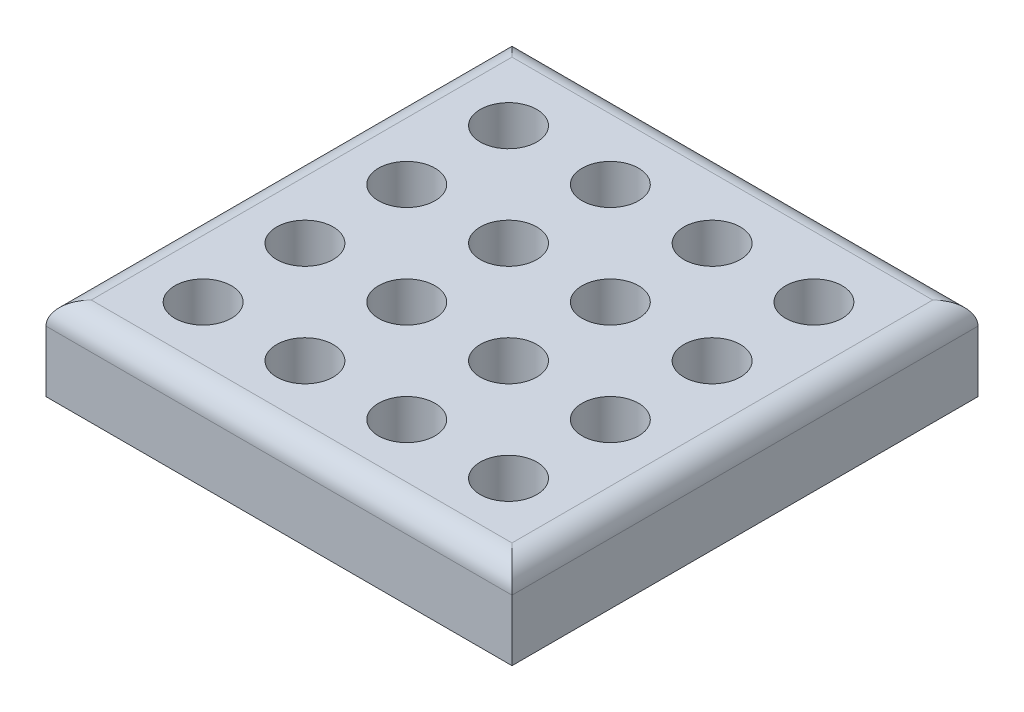
ISO-10303-21;
HEADER;
FILE_DESCRIPTION(('STEP AP214'),'2;1');
FILE_NAME('part.step','',(''),(''),'','','');
FILE_SCHEMA(('AUTOMOTIVE_DESIGN { 1 0 10303 214 1 1 1 1 }'));
ENDSEC;
DATA;
#1=APPLICATION_CONTEXT('core data for automotive mechanical design processes');
#2=APPLICATION_PROTOCOL_DEFINITION('international standard','automotive_design',2000,#1);
#3=PRODUCT_CONTEXT('',#1,'mechanical');
#4=PRODUCT('Part','Part','',(#3));
#5=PRODUCT_RELATED_PRODUCT_CATEGORY('part','',(#4));
#6=PRODUCT_DEFINITION_FORMATION('','',#4);
#7=PRODUCT_DEFINITION_CONTEXT('part definition',#1,'design');
#8=PRODUCT_DEFINITION('design','',#6,#7);
#9=PRODUCT_DEFINITION_SHAPE('','',#8);
#10=(LENGTH_UNIT() NAMED_UNIT(*) SI_UNIT(.MILLI.,.METRE.));
#11=(NAMED_UNIT(*) PLANE_ANGLE_UNIT() SI_UNIT($,.RADIAN.));
#12=(NAMED_UNIT(*) SI_UNIT($,.STERADIAN.) SOLID_ANGLE_UNIT());
#13=UNCERTAINTY_MEASURE_WITH_UNIT(LENGTH_MEASURE(1.E-05),#10,'distance_accuracy_value','');
#14=(GEOMETRIC_REPRESENTATION_CONTEXT(3) GLOBAL_UNCERTAINTY_ASSIGNED_CONTEXT((#13)) GLOBAL_UNIT_ASSIGNED_CONTEXT((#10,
#11,#12)) REPRESENTATION_CONTEXT('',''));
#15=CARTESIAN_POINT('',(0.,0.,0.));
#16=DIRECTION('',(0.,0.,1.));
#17=DIRECTION('',(1.,0.,0.));
#18=AXIS2_PLACEMENT_3D('',#15,#16,#17);
#19=CARTESIAN_POINT('',(125.5,7.00000000000001,-33.9651887919072));
#20=DIRECTION('',(0.,1.,0.));
#21=DIRECTION('',(0.,0.,1.));
#22=AXIS2_PLACEMENT_3D('',#19,#20,#21);
#23=PLANE('',#22);
#24=CARTESIAN_POINT('',(125.5,7.00000000000001,-33.9651887919072));
#25=DIRECTION('',(0.,1.,0.));
#26=DIRECTION('',(0.,0.,1.));
#27=AXIS2_PLACEMENT_3D('',#24,#25,#26);
#28=CIRCLE('',#27,12.5);
#29=CARTESIAN_POINT('',(125.5,7.00000000000001,-21.4651887919072));
#30=VERTEX_POINT('',#29);
#31=EDGE_CURVE('E187',#30,#30,#28,.T.);
#32=ORIENTED_EDGE('',*,*,#31,.T.);
#33=EDGE_LOOP('',(#32));
#34=FACE_BOUND('',#33,.T.);
#35=ADVANCED_FACE('F51',(#34),#23,.T.);
#36=CARTESIAN_POINT('',(125.5,7.00000000000001,-33.9651887919072));
#37=DIRECTION('',(0.,1.,0.));
#38=DIRECTION('',(0.,0.,1.));
#39=AXIS2_PLACEMENT_3D('',#36,#37,#38);
#40=CYLINDRICAL_SURFACE('',#39,12.5);
#41=ORIENTED_EDGE('',*,*,#31,.F.);
#42=EDGE_LOOP('',(#41));
#43=FACE_BOUND('',#42,.T.);
#44=CARTESIAN_POINT('',(125.5,37.,-33.9651887919072));
#45=DIRECTION('',(0.,1.,0.));
#46=DIRECTION('',(0.,0.,1.));
#47=AXIS2_PLACEMENT_3D('',#44,#45,#46);
#48=CIRCLE('',#47,12.5);
#49=CARTESIAN_POINT('',(125.5,37.,-21.4651887919072));
#50=VERTEX_POINT('',#49);
#51=EDGE_CURVE('E184',#50,#50,#48,.T.);
#52=ORIENTED_EDGE('',*,*,#51,.T.);
#53=EDGE_LOOP('',(#52));
#54=FACE_BOUND('',#53,.T.);
#55=ADVANCED_FACE('F278',(#43,#54),#40,.F.);
#56=CARTESIAN_POINT('',(125.5,7.00000000000001,-78.9651887919073));
#57=DIRECTION('',(0.,1.,0.));
#58=DIRECTION('',(0.,0.,1.));
#59=AXIS2_PLACEMENT_3D('',#56,#57,#58);
#60=PLANE('',#59);
#61=CARTESIAN_POINT('',(125.5,7.00000000000001,-78.9651887919073));
#62=DIRECTION('',(0.,1.,0.));
#63=DIRECTION('',(0.,0.,1.));
#64=AXIS2_PLACEMENT_3D('',#61,#62,#63);
#65=CIRCLE('',#64,12.5);
#66=CARTESIAN_POINT('',(125.5,7.00000000000001,-66.4651887919072));
#67=VERTEX_POINT('',#66);
#68=EDGE_CURVE('E181',#67,#67,#65,.T.);
#69=ORIENTED_EDGE('',*,*,#68,.T.);
#70=EDGE_LOOP('',(#69));
#71=FACE_BOUND('',#70,.T.);
#72=ADVANCED_FACE('F284',(#71),#60,.T.);
#73=CARTESIAN_POINT('',(125.5,7.00000000000001,-78.9651887919073));
#74=DIRECTION('',(0.,1.,0.));
#75=DIRECTION('',(0.,0.,1.));
#76=AXIS2_PLACEMENT_3D('',#73,#74,#75);
#77=CYLINDRICAL_SURFACE('',#76,12.5);
#78=ORIENTED_EDGE('',*,*,#68,.F.);
#79=EDGE_LOOP('',(#78));
#80=FACE_BOUND('',#79,.T.);
#81=CARTESIAN_POINT('',(125.5,37.,-78.9651887919073));
#82=DIRECTION('',(0.,1.,0.));
#83=DIRECTION('',(0.,0.,1.));
#84=AXIS2_PLACEMENT_3D('',#81,#82,#83);
#85=CIRCLE('',#84,12.5);
#86=CARTESIAN_POINT('',(125.5,37.,-66.4651887919072));
#87=VERTEX_POINT('',#86);
#88=EDGE_CURVE('E178',#87,#87,#85,.T.);
#89=ORIENTED_EDGE('',*,*,#88,.T.);
#90=EDGE_LOOP('',(#89));
#91=FACE_BOUND('',#90,.T.);
#92=ADVANCED_FACE('F350',(#80,#91),#77,.F.);
#93=CARTESIAN_POINT('',(80.5,7.00000000000001,-33.9651887919072));
#94=DIRECTION('',(0.,1.,0.));
#95=DIRECTION('',(0.,0.,1.));
#96=AXIS2_PLACEMENT_3D('',#93,#94,#95);
#97=PLANE('',#96);
#98=CARTESIAN_POINT('',(80.5,7.00000000000001,-33.9651887919072));
#99=DIRECTION('',(0.,1.,0.));
#100=DIRECTION('',(0.,0.,1.));
#101=AXIS2_PLACEMENT_3D('',#98,#99,#100);
#102=CIRCLE('',#101,12.5);
#103=CARTESIAN_POINT('',(80.5,7.00000000000001,-21.4651887919072));
#104=VERTEX_POINT('',#103);
#105=EDGE_CURVE('E175',#104,#104,#102,.T.);
#106=ORIENTED_EDGE('',*,*,#105,.T.);
#107=EDGE_LOOP('',(#106));
#108=FACE_BOUND('',#107,.T.);
#109=ADVANCED_FACE('F352',(#108),#97,.T.);
#110=CARTESIAN_POINT('',(80.5,7.00000000000001,-33.9651887919072));
#111=DIRECTION('',(0.,1.,0.));
#112=DIRECTION('',(0.,0.,1.));
#113=AXIS2_PLACEMENT_3D('',#110,#111,#112);
#114=CYLINDRICAL_SURFACE('',#113,12.5);
#115=ORIENTED_EDGE('',*,*,#105,.F.);
#116=EDGE_LOOP('',(#115));
#117=FACE_BOUND('',#116,.T.);
#118=CARTESIAN_POINT('',(80.5,37.,-33.9651887919072));
#119=DIRECTION('',(0.,1.,0.));
#120=DIRECTION('',(0.,0.,1.));
#121=AXIS2_PLACEMENT_3D('',#118,#119,#120);
#122=CIRCLE('',#121,12.5);
#123=CARTESIAN_POINT('',(80.5,37.,-21.4651887919072));
#124=VERTEX_POINT('',#123);
#125=EDGE_CURVE('E172',#124,#124,#122,.T.);
#126=ORIENTED_EDGE('',*,*,#125,.T.);
#127=EDGE_LOOP('',(#126));
#128=FACE_BOUND('',#127,.T.);
#129=ADVANCED_FACE('F359',(#117,#128),#114,.F.);
#130=CARTESIAN_POINT('',(80.5,7.00000000000001,-78.9651887919073));
#131=DIRECTION('',(0.,1.,0.));
#132=DIRECTION('',(0.,0.,1.));
#133=AXIS2_PLACEMENT_3D('',#130,#131,#132);
#134=PLANE('',#133);
#135=CARTESIAN_POINT('',(80.5,7.00000000000001,-78.9651887919073));
#136=DIRECTION('',(0.,1.,0.));
#137=DIRECTION('',(0.,0.,1.));
#138=AXIS2_PLACEMENT_3D('',#135,#136,#137);
#139=CIRCLE('',#138,12.5);
#140=CARTESIAN_POINT('',(80.5,7.00000000000001,-66.4651887919072));
#141=VERTEX_POINT('',#140);
#142=EDGE_CURVE('E169',#141,#141,#139,.T.);
#143=ORIENTED_EDGE('',*,*,#142,.T.);
#144=EDGE_LOOP('',(#143));
#145=FACE_BOUND('',#144,.T.);
#146=ADVANCED_FACE('F367',(#145),#134,.T.);
#147=CARTESIAN_POINT('',(80.5,7.00000000000001,-78.9651887919073));
#148=DIRECTION('',(0.,1.,0.));
#149=DIRECTION('',(0.,0.,1.));
#150=AXIS2_PLACEMENT_3D('',#147,#148,#149);
#151=CYLINDRICAL_SURFACE('',#150,12.5);
#152=ORIENTED_EDGE('',*,*,#142,.F.);
#153=EDGE_LOOP('',(#152));
#154=FACE_BOUND('',#153,.T.);
#155=CARTESIAN_POINT('',(80.5,37.,-78.9651887919073));
#156=DIRECTION('',(0.,1.,0.));
#157=DIRECTION('',(0.,0.,1.));
#158=AXIS2_PLACEMENT_3D('',#155,#156,#157);
#159=CIRCLE('',#158,12.5);
#160=CARTESIAN_POINT('',(80.5,37.,-66.4651887919072));
#161=VERTEX_POINT('',#160);
#162=EDGE_CURVE('E166',#161,#161,#159,.T.);
#163=ORIENTED_EDGE('',*,*,#162,.T.);
#164=EDGE_LOOP('',(#163));
#165=FACE_BOUND('',#164,.T.);
#166=ADVANCED_FACE('F371',(#154,#165),#151,.F.);
#167=CARTESIAN_POINT('',(170.5,7.00000000000001,-33.9651887919072));
#168=DIRECTION('',(0.,1.,0.));
#169=DIRECTION('',(0.,0.,1.));
#170=AXIS2_PLACEMENT_3D('',#167,#168,#169);
#171=PLANE('',#170);
#172=CARTESIAN_POINT('',(170.5,7.00000000000001,-33.9651887919072));
#173=DIRECTION('',(0.,1.,0.));
#174=DIRECTION('',(0.,0.,1.));
#175=AXIS2_PLACEMENT_3D('',#172,#173,#174);
#176=CIRCLE('',#175,12.5);
#177=CARTESIAN_POINT('',(170.5,7.00000000000001,-21.4651887919072));
#178=VERTEX_POINT('',#177);
#179=EDGE_CURVE('E163',#178,#178,#176,.T.);
#180=ORIENTED_EDGE('',*,*,#179,.T.);
#181=EDGE_LOOP('',(#180));
#182=FACE_BOUND('',#181,.T.);
#183=ADVANCED_FACE('F375',(#182),#171,.T.);
#184=CARTESIAN_POINT('',(170.5,7.00000000000001,-33.9651887919072));
#185=DIRECTION('',(0.,1.,0.));
#186=DIRECTION('',(0.,0.,1.));
#187=AXIS2_PLACEMENT_3D('',#184,#185,#186);
#188=CYLINDRICAL_SURFACE('',#187,12.5);
#189=ORIENTED_EDGE('',*,*,#179,.F.);
#190=EDGE_LOOP('',(#189));
#191=FACE_BOUND('',#190,.T.);
#192=CARTESIAN_POINT('',(170.5,37.,-33.9651887919072));
#193=DIRECTION('',(0.,1.,0.));
#194=DIRECTION('',(0.,0.,1.));
#195=AXIS2_PLACEMENT_3D('',#192,#193,#194);
#196=CIRCLE('',#195,12.5);
#197=CARTESIAN_POINT('',(170.5,37.,-21.4651887919072));
#198=VERTEX_POINT('',#197);
#199=EDGE_CURVE('E160',#198,#198,#196,.T.);
#200=ORIENTED_EDGE('',*,*,#199,.T.);
#201=EDGE_LOOP('',(#200));
#202=FACE_BOUND('',#201,.T.);
#203=ADVANCED_FACE('F379',(#191,#202),#188,.F.);
#204=CARTESIAN_POINT('',(170.5,7.00000000000001,-78.9651887919073));
#205=DIRECTION('',(0.,1.,0.));
#206=DIRECTION('',(0.,0.,1.));
#207=AXIS2_PLACEMENT_3D('',#204,#205,#206);
#208=PLANE('',#207);
#209=CARTESIAN_POINT('',(170.5,7.00000000000001,-78.9651887919073));
#210=DIRECTION('',(0.,1.,0.));
#211=DIRECTION('',(0.,0.,1.));
#212=AXIS2_PLACEMENT_3D('',#209,#210,#211);
#213=CIRCLE('',#212,12.5);
#214=CARTESIAN_POINT('',(170.5,7.00000000000001,-66.4651887919072));
#215=VERTEX_POINT('',#214);
#216=EDGE_CURVE('E157',#215,#215,#213,.T.);
#217=ORIENTED_EDGE('',*,*,#216,.T.);
#218=EDGE_LOOP('',(#217));
#219=FACE_BOUND('',#218,.T.);
#220=ADVANCED_FACE('F383',(#219),#208,.T.);
#221=CARTESIAN_POINT('',(170.5,7.00000000000001,-78.9651887919073));
#222=DIRECTION('',(0.,1.,0.));
#223=DIRECTION('',(0.,0.,1.));
#224=AXIS2_PLACEMENT_3D('',#221,#222,#223);
#225=CYLINDRICAL_SURFACE('',#224,12.5);
#226=ORIENTED_EDGE('',*,*,#216,.F.);
#227=EDGE_LOOP('',(#226));
#228=FACE_BOUND('',#227,.T.);
#229=CARTESIAN_POINT('',(170.5,37.,-78.9651887919073));
#230=DIRECTION('',(0.,1.,0.));
#231=DIRECTION('',(0.,0.,1.));
#232=AXIS2_PLACEMENT_3D('',#229,#230,#231);
#233=CIRCLE('',#232,12.5);
#234=CARTESIAN_POINT('',(170.5,37.,-66.4651887919072));
#235=VERTEX_POINT('',#234);
#236=EDGE_CURVE('E154',#235,#235,#233,.T.);
#237=ORIENTED_EDGE('',*,*,#236,.T.);
#238=EDGE_LOOP('',(#237));
#239=FACE_BOUND('',#238,.T.);
#240=ADVANCED_FACE('F387',(#228,#239),#225,.F.);
#241=CARTESIAN_POINT('',(35.5,7.00000000000001,-33.9651887919072));
#242=DIRECTION('',(0.,1.,0.));
#243=DIRECTION('',(0.,0.,1.));
#244=AXIS2_PLACEMENT_3D('',#241,#242,#243);
#245=PLANE('',#244);
#246=CARTESIAN_POINT('',(35.5,7.00000000000001,-33.9651887919072));
#247=DIRECTION('',(0.,1.,0.));
#248=DIRECTION('',(0.,0.,1.));
#249=AXIS2_PLACEMENT_3D('',#246,#247,#248);
#250=CIRCLE('',#249,12.5);
#251=CARTESIAN_POINT('',(35.5,7.00000000000001,-21.4651887919072));
#252=VERTEX_POINT('',#251);
#253=EDGE_CURVE('E151',#252,#252,#250,.T.);
#254=ORIENTED_EDGE('',*,*,#253,.T.);
#255=EDGE_LOOP('',(#254));
#256=FACE_BOUND('',#255,.T.);
#257=ADVANCED_FACE('F391',(#256),#245,.T.);
#258=CARTESIAN_POINT('',(35.5,7.00000000000001,-33.9651887919072));
#259=DIRECTION('',(0.,1.,0.));
#260=DIRECTION('',(0.,0.,1.));
#261=AXIS2_PLACEMENT_3D('',#258,#259,#260);
#262=CYLINDRICAL_SURFACE('',#261,12.5);
#263=ORIENTED_EDGE('',*,*,#253,.F.);
#264=EDGE_LOOP('',(#263));
#265=FACE_BOUND('',#264,.T.);
#266=CARTESIAN_POINT('',(35.5,37.,-33.9651887919072));
#267=DIRECTION('',(0.,1.,0.));
#268=DIRECTION('',(0.,0.,1.));
#269=AXIS2_PLACEMENT_3D('',#266,#267,#268);
#270=CIRCLE('',#269,12.5);
#271=CARTESIAN_POINT('',(35.5,37.,-21.4651887919072));
#272=VERTEX_POINT('',#271);
#273=EDGE_CURVE('E148',#272,#272,#270,.T.);
#274=ORIENTED_EDGE('',*,*,#273,.T.);
#275=EDGE_LOOP('',(#274));
#276=FACE_BOUND('',#275,.T.);
#277=ADVANCED_FACE('F395',(#265,#276),#262,.F.);
#278=CARTESIAN_POINT('',(35.5,7.00000000000001,-78.9651887919073));
#279=DIRECTION('',(0.,1.,0.));
#280=DIRECTION('',(0.,0.,1.));
#281=AXIS2_PLACEMENT_3D('',#278,#279,#280);
#282=PLANE('',#281);
#283=CARTESIAN_POINT('',(35.5,7.00000000000001,-78.9651887919073));
#284=DIRECTION('',(0.,1.,0.));
#285=DIRECTION('',(0.,0.,1.));
#286=AXIS2_PLACEMENT_3D('',#283,#284,#285);
#287=CIRCLE('',#286,12.5);
#288=CARTESIAN_POINT('',(35.5,7.00000000000001,-66.4651887919072));
#289=VERTEX_POINT('',#288);
#290=EDGE_CURVE('E145',#289,#289,#287,.T.);
#291=ORIENTED_EDGE('',*,*,#290,.T.);
#292=EDGE_LOOP('',(#291));
#293=FACE_BOUND('',#292,.T.);
#294=ADVANCED_FACE('F399',(#293),#282,.T.);
#295=CARTESIAN_POINT('',(35.5,7.00000000000001,-78.9651887919073));
#296=DIRECTION('',(0.,1.,0.));
#297=DIRECTION('',(0.,0.,1.));
#298=AXIS2_PLACEMENT_3D('',#295,#296,#297);
#299=CYLINDRICAL_SURFACE('',#298,12.5);
#300=ORIENTED_EDGE('',*,*,#290,.F.);
#301=EDGE_LOOP('',(#300));
#302=FACE_BOUND('',#301,.T.);
#303=CARTESIAN_POINT('',(35.5,37.,-78.9651887919073));
#304=DIRECTION('',(0.,1.,0.));
#305=DIRECTION('',(0.,0.,1.));
#306=AXIS2_PLACEMENT_3D('',#303,#304,#305);
#307=CIRCLE('',#306,12.5);
#308=CARTESIAN_POINT('',(35.5,37.,-66.4651887919072));
#309=VERTEX_POINT('',#308);
#310=EDGE_CURVE('E113',#309,#309,#307,.T.);
#311=ORIENTED_EDGE('',*,*,#310,.T.);
#312=EDGE_LOOP('',(#311));
#313=FACE_BOUND('',#312,.T.);
#314=ADVANCED_FACE('F403',(#302,#313),#299,.F.);
#315=CARTESIAN_POINT('',(0.,37.,0.));
#316=DIRECTION('',(1.,0.,0.));
#317=DIRECTION('',(0.,0.,-1.));
#318=AXIS2_PLACEMENT_3D('',#315,#316,#317);
#319=PLANE('',#318);
#320=DIRECTION('',(0.,-1.,0.));
#321=VECTOR('',#320,1.);
#322=CARTESIAN_POINT('',(0.,37.,0.));
#323=LINE('',#322,#321);
#324=CARTESIAN_POINT('',(0.,27.,0.));
#325=VERTEX_POINT('',#324);
#326=CARTESIAN_POINT('',(0.,0.,0.));
#327=VERTEX_POINT('',#326);
#328=EDGE_CURVE('E104',#325,#327,#323,.T.);
#329=ORIENTED_EDGE('',*,*,#328,.F.);
#330=DIRECTION('',(0.,0.,1.));
#331=VECTOR('',#330,1.);
#332=CARTESIAN_POINT('',(0.,27.,0.));
#333=LINE('',#332,#331);
#334=CARTESIAN_POINT('',(0.,27.,-206.));
#335=VERTEX_POINT('',#334);
#336=EDGE_CURVE('E11',#325,#335,#333,.F.);
#337=ORIENTED_EDGE('',*,*,#336,.T.);
#338=DIRECTION('',(0.,-1.,0.));
#339=VECTOR('',#338,1.);
#340=CARTESIAN_POINT('',(0.,37.,-206.));
#341=LINE('',#340,#339);
#342=CARTESIAN_POINT('',(0.,0.,-206.));
#343=VERTEX_POINT('',#342);
#344=EDGE_CURVE('E125',#335,#343,#341,.T.);
#345=ORIENTED_EDGE('',*,*,#344,.T.);
#346=DIRECTION('',(0.,0.,1.));
#347=VECTOR('',#346,1.);
#348=CARTESIAN_POINT('',(0.,0.,0.));
#349=LINE('',#348,#347);
#350=EDGE_CURVE('E120',#343,#327,#349,.T.);
#351=ORIENTED_EDGE('',*,*,#350,.T.);
#352=EDGE_LOOP('',(#329,#337,#345,#351));
#353=FACE_BOUND('',#352,.T.);
#354=ADVANCED_FACE('F124',(#353),#319,.F.);
#355=CARTESIAN_POINT('',(0.,37.,0.));
#356=DIRECTION('',(0.,0.,-1.));
#357=DIRECTION('',(-1.,0.,0.));
#358=AXIS2_PLACEMENT_3D('',#355,#356,#357);
#359=PLANE('',#358);
#360=DIRECTION('',(0.,-1.,0.));
#361=VECTOR('',#360,1.);
#362=CARTESIAN_POINT('',(206.,37.,0.));
#363=LINE('',#362,#361);
#364=CARTESIAN_POINT('',(206.,27.,0.));
#365=VERTEX_POINT('',#364);
#366=CARTESIAN_POINT('',(206.,0.,0.));
#367=VERTEX_POINT('',#366);
#368=EDGE_CURVE('E114',#365,#367,#363,.T.);
#369=ORIENTED_EDGE('',*,*,#368,.F.);
#370=DIRECTION('',(1.,0.,0.));
#371=VECTOR('',#370,1.);
#372=CARTESIAN_POINT('',(0.,27.,0.));
#373=LINE('',#372,#371);
#374=EDGE_CURVE('E111',#365,#325,#373,.F.);
#375=ORIENTED_EDGE('',*,*,#374,.T.);
#376=ORIENTED_EDGE('',*,*,#328,.T.);
#377=DIRECTION('',(1.,0.,0.));
#378=VECTOR('',#377,1.);
#379=CARTESIAN_POINT('',(0.,0.,0.));
#380=LINE('',#379,#378);
#381=EDGE_CURVE('E108',#327,#367,#380,.T.);
#382=ORIENTED_EDGE('',*,*,#381,.T.);
#383=EDGE_LOOP('',(#369,#375,#376,#382));
#384=FACE_BOUND('',#383,.T.);
#385=ADVANCED_FACE('F107',(#384),#359,.F.);
#386=CARTESIAN_POINT('',(206.,37.,0.));
#387=DIRECTION('',(-1.,0.,0.));
#388=DIRECTION('',(0.,0.,1.));
#389=AXIS2_PLACEMENT_3D('',#386,#387,#388);
#390=PLANE('',#389);
#391=DIRECTION('',(0.,-1.,0.));
#392=VECTOR('',#391,1.);
#393=CARTESIAN_POINT('',(206.,37.,-206.));
#394=LINE('',#393,#392);
#395=CARTESIAN_POINT('',(206.,27.,-206.));
#396=VERTEX_POINT('',#395);
#397=CARTESIAN_POINT('',(206.,0.,-206.));
#398=VERTEX_POINT('',#397);
#399=EDGE_CURVE('E140',#396,#398,#394,.T.);
#400=ORIENTED_EDGE('',*,*,#399,.F.);
#401=DIRECTION('',(0.,0.,-1.));
#402=VECTOR('',#401,1.);
#403=CARTESIAN_POINT('',(206.,27.,0.));
#404=LINE('',#403,#402);
#405=EDGE_CURVE('E200',#396,#365,#404,.F.);
#406=ORIENTED_EDGE('',*,*,#405,.T.);
#407=ORIENTED_EDGE('',*,*,#368,.T.);
#408=DIRECTION('',(0.,0.,-1.));
#409=VECTOR('',#408,1.);
#410=CARTESIAN_POINT('',(206.,0.,0.));
#411=LINE('',#410,#409);
#412=EDGE_CURVE('E122',#367,#398,#411,.T.);
#413=ORIENTED_EDGE('',*,*,#412,.T.);
#414=EDGE_LOOP('',(#400,#406,#407,#413));
#415=FACE_BOUND('',#414,.T.);
#416=ADVANCED_FACE('F311',(#415),#390,.F.);
#417=CARTESIAN_POINT('',(0.,37.,-206.));
#418=DIRECTION('',(0.,0.,1.));
#419=DIRECTION('',(1.,0.,0.));
#420=AXIS2_PLACEMENT_3D('',#417,#418,#419);
#421=PLANE('',#420);
#422=ORIENTED_EDGE('',*,*,#344,.F.);
#423=DIRECTION('',(-1.,0.,0.));
#424=VECTOR('',#423,1.);
#425=CARTESIAN_POINT('',(0.,27.,-206.));
#426=LINE('',#425,#424);
#427=EDGE_CURVE('E60',#335,#396,#426,.F.);
#428=ORIENTED_EDGE('',*,*,#427,.T.);
#429=ORIENTED_EDGE('',*,*,#399,.T.);
#430=DIRECTION('',(-1.,0.,0.));
#431=VECTOR('',#430,1.);
#432=CARTESIAN_POINT('',(0.,0.,-206.));
#433=LINE('',#432,#431);
#434=EDGE_CURVE('E137',#398,#343,#433,.T.);
#435=ORIENTED_EDGE('',*,*,#434,.T.);
#436=EDGE_LOOP('',(#422,#428,#429,#435));
#437=FACE_BOUND('',#436,.T.);
#438=ADVANCED_FACE('F317',(#437),#421,.F.);
#439=CARTESIAN_POINT('',(0.,37.,0.));
#440=DIRECTION('',(0.,-1.,0.));
#441=DIRECTION('',(0.,0.,-1.));
#442=AXIS2_PLACEMENT_3D('',#439,#440,#441);
#443=PLANE('',#442);
#444=DIRECTION('',(0.,0.,1.));
#445=VECTOR('',#444,1.);
#446=CARTESIAN_POINT('',(10.,37.,0.));
#447=LINE('',#446,#445);
#448=CARTESIAN_POINT('',(10.,37.,-196.));
#449=VERTEX_POINT('',#448);
#450=CARTESIAN_POINT('',(10.,37.,-10.));
#451=VERTEX_POINT('',#450);
#452=EDGE_CURVE('E190',#449,#451,#447,.T.);
#453=ORIENTED_EDGE('',*,*,#452,.T.);
#454=DIRECTION('',(1.,0.,0.));
#455=VECTOR('',#454,1.);
#456=CARTESIAN_POINT('',(0.,37.,-10.));
#457=LINE('',#456,#455);
#458=CARTESIAN_POINT('',(196.,37.,-10.));
#459=VERTEX_POINT('',#458);
#460=EDGE_CURVE('E196',#451,#459,#457,.T.);
#461=ORIENTED_EDGE('',*,*,#460,.T.);
#462=DIRECTION('',(0.,0.,-1.));
#463=VECTOR('',#462,1.);
#464=CARTESIAN_POINT('',(196.,37.,0.));
#465=LINE('',#464,#463);
#466=CARTESIAN_POINT('',(196.,37.,-196.));
#467=VERTEX_POINT('',#466);
#468=EDGE_CURVE('E194',#459,#467,#465,.T.);
#469=ORIENTED_EDGE('',*,*,#468,.T.);
#470=DIRECTION('',(-1.,0.,0.));
#471=VECTOR('',#470,1.);
#472=CARTESIAN_POINT('',(0.,37.,-196.));
#473=LINE('',#472,#471);
#474=EDGE_CURVE('E192',#467,#449,#473,.T.);
#475=ORIENTED_EDGE('',*,*,#474,.T.);
#476=EDGE_LOOP('',(#453,#461,#469,#475));
#477=FACE_BOUND('',#476,.T.);
#478=CARTESIAN_POINT('',(125.5,37.,-123.965188791907));
#479=DIRECTION('',(0.,1.,0.));
#480=DIRECTION('',(0.,0.,1.));
#481=AXIS2_PLACEMENT_3D('',#478,#479,#480);
#482=CIRCLE('',#481,12.5);
#483=CARTESIAN_POINT('',(125.5,37.,-111.465188791907));
#484=VERTEX_POINT('',#483);
#485=EDGE_CURVE('E213',#484,#484,#482,.T.);
#486=ORIENTED_EDGE('',*,*,#485,.F.);
#487=EDGE_LOOP('',(#486));
#488=FACE_BOUND('',#487,.T.);
#489=CARTESIAN_POINT('',(80.5,37.,-123.965188791907));
#490=DIRECTION('',(0.,1.,0.));
#491=DIRECTION('',(0.,0.,1.));
#492=AXIS2_PLACEMENT_3D('',#489,#490,#491);
#493=CIRCLE('',#492,12.5);
#494=CARTESIAN_POINT('',(80.5,37.,-111.465188791907));
#495=VERTEX_POINT('',#494);
#496=EDGE_CURVE('E223',#495,#495,#493,.T.);
#497=ORIENTED_EDGE('',*,*,#496,.F.);
#498=EDGE_LOOP('',(#497));
#499=FACE_BOUND('',#498,.T.);
#500=CARTESIAN_POINT('',(170.5,37.,-123.965188791907));
#501=DIRECTION('',(0.,1.,0.));
#502=DIRECTION('',(0.,0.,1.));
#503=AXIS2_PLACEMENT_3D('',#500,#501,#502);
#504=CIRCLE('',#503,12.5);
#505=CARTESIAN_POINT('',(170.5,37.,-111.465188791907));
#506=VERTEX_POINT('',#505);
#507=EDGE_CURVE('E231',#506,#506,#504,.T.);
#508=ORIENTED_EDGE('',*,*,#507,.F.);
#509=EDGE_LOOP('',(#508));
#510=FACE_BOUND('',#509,.T.);
#511=CARTESIAN_POINT('',(35.5,37.,-123.965188791907));
#512=DIRECTION('',(0.,1.,0.));
#513=DIRECTION('',(0.,0.,1.));
#514=AXIS2_PLACEMENT_3D('',#511,#512,#513);
#515=CIRCLE('',#514,12.5);
#516=CARTESIAN_POINT('',(35.5,37.,-111.465188791907));
#517=VERTEX_POINT('',#516);
#518=EDGE_CURVE('E237',#517,#517,#515,.T.);
#519=ORIENTED_EDGE('',*,*,#518,.F.);
#520=EDGE_LOOP('',(#519));
#521=FACE_BOUND('',#520,.T.);
#522=CARTESIAN_POINT('',(35.5,37.,-168.965188791907));
#523=DIRECTION('',(0.,1.,0.));
#524=DIRECTION('',(0.,0.,1.));
#525=AXIS2_PLACEMENT_3D('',#522,#523,#524);
#526=CIRCLE('',#525,12.5);
#527=CARTESIAN_POINT('',(35.5,37.,-156.465188791907));
#528=VERTEX_POINT('',#527);
#529=EDGE_CURVE('E130',#528,#528,#526,.T.);
#530=ORIENTED_EDGE('',*,*,#529,.F.);
#531=EDGE_LOOP('',(#530));
#532=FACE_BOUND('',#531,.T.);
#533=CARTESIAN_POINT('',(125.5,37.,-168.965188791907));
#534=DIRECTION('',(0.,1.,0.));
#535=DIRECTION('',(0.,0.,1.));
#536=AXIS2_PLACEMENT_3D('',#533,#534,#535);
#537=CIRCLE('',#536,12.5);
#538=CARTESIAN_POINT('',(125.5,37.,-156.465188791907));
#539=VERTEX_POINT('',#538);
#540=EDGE_CURVE('E245',#539,#539,#537,.T.);
#541=ORIENTED_EDGE('',*,*,#540,.F.);
#542=EDGE_LOOP('',(#541));
#543=FACE_BOUND('',#542,.T.);
#544=CARTESIAN_POINT('',(80.5,37.,-168.965188791907));
#545=DIRECTION('',(0.,1.,0.));
#546=DIRECTION('',(0.,0.,1.));
#547=AXIS2_PLACEMENT_3D('',#544,#545,#546);
#548=CIRCLE('',#547,12.5);
#549=CARTESIAN_POINT('',(80.5,37.,-156.465188791907));
#550=VERTEX_POINT('',#549);
#551=EDGE_CURVE('E251',#550,#550,#548,.T.);
#552=ORIENTED_EDGE('',*,*,#551,.F.);
#553=EDGE_LOOP('',(#552));
#554=FACE_BOUND('',#553,.T.);
#555=CARTESIAN_POINT('',(170.5,37.,-168.965188791907));
#556=DIRECTION('',(0.,1.,0.));
#557=DIRECTION('',(0.,0.,1.));
#558=AXIS2_PLACEMENT_3D('',#555,#556,#557);
#559=CIRCLE('',#558,12.5);
#560=CARTESIAN_POINT('',(170.5,37.,-156.465188791907));
#561=VERTEX_POINT('',#560);
#562=EDGE_CURVE('E256',#561,#561,#559,.T.);
#563=ORIENTED_EDGE('',*,*,#562,.F.);
#564=EDGE_LOOP('',(#563));
#565=FACE_BOUND('',#564,.T.);
#566=ORIENTED_EDGE('',*,*,#310,.F.);
#567=EDGE_LOOP('',(#566));
#568=FACE_BOUND('',#567,.T.);
#569=ORIENTED_EDGE('',*,*,#273,.F.);
#570=EDGE_LOOP('',(#569));
#571=FACE_BOUND('',#570,.T.);
#572=ORIENTED_EDGE('',*,*,#236,.F.);
#573=EDGE_LOOP('',(#572));
#574=FACE_BOUND('',#573,.T.);
#575=ORIENTED_EDGE('',*,*,#199,.F.);
#576=EDGE_LOOP('',(#575));
#577=FACE_BOUND('',#576,.T.);
#578=ORIENTED_EDGE('',*,*,#162,.F.);
#579=EDGE_LOOP('',(#578));
#580=FACE_BOUND('',#579,.T.);
#581=ORIENTED_EDGE('',*,*,#125,.F.);
#582=EDGE_LOOP('',(#581));
#583=FACE_BOUND('',#582,.T.);
#584=ORIENTED_EDGE('',*,*,#88,.F.);
#585=EDGE_LOOP('',(#584));
#586=FACE_BOUND('',#585,.T.);
#587=ORIENTED_EDGE('',*,*,#51,.F.);
#588=EDGE_LOOP('',(#587));
#589=FACE_BOUND('',#588,.T.);
#590=ADVANCED_FACE('F274',(#477,#488,#499,#510,#521,#532,#543,#554,#565,#568,#571,#574,#577,
#580,#583,#586,#589),#443,.F.);
#591=CARTESIAN_POINT('',(0.,0.,0.));
#592=DIRECTION('',(0.,-1.,0.));
#593=DIRECTION('',(0.,0.,-1.));
#594=AXIS2_PLACEMENT_3D('',#591,#592,#593);
#595=PLANE('',#594);
#596=ORIENTED_EDGE('',*,*,#350,.F.);
#597=ORIENTED_EDGE('',*,*,#434,.F.);
#598=ORIENTED_EDGE('',*,*,#412,.F.);
#599=ORIENTED_EDGE('',*,*,#381,.F.);
#600=EDGE_LOOP('',(#596,#597,#598,#599));
#601=FACE_BOUND('',#600,.T.);
#602=ADVANCED_FACE('F118',(#601),#595,.T.);
#603=CARTESIAN_POINT('',(170.5,7.00000000000001,-168.965188791907));
#604=DIRECTION('',(0.,1.,0.));
#605=DIRECTION('',(0.,0.,1.));
#606=AXIS2_PLACEMENT_3D('',#603,#604,#605);
#607=CYLINDRICAL_SURFACE('',#606,12.5);
#608=CARTESIAN_POINT('',(170.5,7.00000000000001,-168.965188791907));
#609=DIRECTION('',(0.,1.,0.));
#610=DIRECTION('',(0.,0.,1.));
#611=AXIS2_PLACEMENT_3D('',#608,#609,#610);
#612=CIRCLE('',#611,12.5);
#613=CARTESIAN_POINT('',(170.5,7.00000000000001,-156.465188791907));
#614=VERTEX_POINT('',#613);
#615=EDGE_CURVE('E133',#614,#614,#612,.T.);
#616=ORIENTED_EDGE('',*,*,#615,.F.);
#617=EDGE_LOOP('',(#616));
#618=FACE_BOUND('',#617,.T.);
#619=ORIENTED_EDGE('',*,*,#562,.T.);
#620=EDGE_LOOP('',(#619));
#621=FACE_BOUND('',#620,.T.);
#622=ADVANCED_FACE('F265',(#618,#621),#607,.F.);
#623=CARTESIAN_POINT('',(170.5,7.00000000000001,-168.965188791907));
#624=DIRECTION('',(0.,1.,0.));
#625=DIRECTION('',(0.,0.,1.));
#626=AXIS2_PLACEMENT_3D('',#623,#624,#625);
#627=PLANE('',#626);
#628=ORIENTED_EDGE('',*,*,#615,.T.);
#629=EDGE_LOOP('',(#628));
#630=FACE_BOUND('',#629,.T.);
#631=ADVANCED_FACE('F263',(#630),#627,.T.);
#632=CARTESIAN_POINT('',(80.5,7.00000000000001,-168.965188791907));
#633=DIRECTION('',(0.,1.,0.));
#634=DIRECTION('',(0.,0.,1.));
#635=AXIS2_PLACEMENT_3D('',#632,#633,#634);
#636=CYLINDRICAL_SURFACE('',#635,12.5);
#637=CARTESIAN_POINT('',(80.5,7.00000000000001,-168.965188791907));
#638=DIRECTION('',(0.,1.,0.));
#639=DIRECTION('',(0.,0.,1.));
#640=AXIS2_PLACEMENT_3D('',#637,#638,#639);
#641=CIRCLE('',#640,12.5);
#642=CARTESIAN_POINT('',(80.5,7.00000000000001,-156.465188791907));
#643=VERTEX_POINT('',#642);
#644=EDGE_CURVE('E254',#643,#643,#641,.T.);
#645=ORIENTED_EDGE('',*,*,#644,.F.);
#646=EDGE_LOOP('',(#645));
#647=FACE_BOUND('',#646,.T.);
#648=ORIENTED_EDGE('',*,*,#551,.T.);
#649=EDGE_LOOP('',(#648));
#650=FACE_BOUND('',#649,.T.);
#651=ADVANCED_FACE('F272',(#647,#650),#636,.F.);
#652=CARTESIAN_POINT('',(80.5,7.00000000000001,-168.965188791907));
#653=DIRECTION('',(0.,1.,0.));
#654=DIRECTION('',(0.,0.,1.));
#655=AXIS2_PLACEMENT_3D('',#652,#653,#654);
#656=PLANE('',#655);
#657=ORIENTED_EDGE('',*,*,#644,.T.);
#658=EDGE_LOOP('',(#657));
#659=FACE_BOUND('',#658,.T.);
#660=ADVANCED_FACE('F448',(#659),#656,.T.);
#661=CARTESIAN_POINT('',(125.5,7.00000000000001,-168.965188791907));
#662=DIRECTION('',(0.,1.,0.));
#663=DIRECTION('',(0.,0.,1.));
#664=AXIS2_PLACEMENT_3D('',#661,#662,#663);
#665=CYLINDRICAL_SURFACE('',#664,12.5);
#666=CARTESIAN_POINT('',(125.5,7.00000000000001,-168.965188791907));
#667=DIRECTION('',(0.,1.,0.));
#668=DIRECTION('',(0.,0.,1.));
#669=AXIS2_PLACEMENT_3D('',#666,#667,#668);
#670=CIRCLE('',#669,12.5);
#671=CARTESIAN_POINT('',(125.5,7.00000000000001,-156.465188791907));
#672=VERTEX_POINT('',#671);
#673=EDGE_CURVE('E248',#672,#672,#670,.T.);
#674=ORIENTED_EDGE('',*,*,#673,.F.);
#675=EDGE_LOOP('',(#674));
#676=FACE_BOUND('',#675,.T.);
#677=ORIENTED_EDGE('',*,*,#540,.T.);
#678=EDGE_LOOP('',(#677));
#679=FACE_BOUND('',#678,.T.);
#680=ADVANCED_FACE('F458',(#676,#679),#665,.F.);
#681=CARTESIAN_POINT('',(125.5,7.00000000000001,-168.965188791907));
#682=DIRECTION('',(0.,1.,0.));
#683=DIRECTION('',(0.,0.,1.));
#684=AXIS2_PLACEMENT_3D('',#681,#682,#683);
#685=PLANE('',#684);
#686=ORIENTED_EDGE('',*,*,#673,.T.);
#687=EDGE_LOOP('',(#686));
#688=FACE_BOUND('',#687,.T.);
#689=ADVANCED_FACE('F467',(#688),#685,.T.);
#690=CARTESIAN_POINT('',(35.5,7.00000000000001,-168.965188791907));
#691=DIRECTION('',(0.,1.,0.));
#692=DIRECTION('',(0.,0.,1.));
#693=AXIS2_PLACEMENT_3D('',#690,#691,#692);
#694=CYLINDRICAL_SURFACE('',#693,12.5);
#695=CARTESIAN_POINT('',(35.5,7.00000000000001,-168.965188791907));
#696=DIRECTION('',(0.,1.,0.));
#697=DIRECTION('',(0.,0.,1.));
#698=AXIS2_PLACEMENT_3D('',#695,#696,#697);
#699=CIRCLE('',#698,12.5);
#700=CARTESIAN_POINT('',(35.5,7.00000000000001,-156.465188791907));
#701=VERTEX_POINT('',#700);
#702=EDGE_CURVE('E127',#701,#701,#699,.T.);
#703=ORIENTED_EDGE('',*,*,#702,.F.);
#704=EDGE_LOOP('',(#703));
#705=FACE_BOUND('',#704,.T.);
#706=ORIENTED_EDGE('',*,*,#529,.T.);
#707=EDGE_LOOP('',(#706));
#708=FACE_BOUND('',#707,.T.);
#709=ADVANCED_FACE('F477',(#705,#708),#694,.F.);
#710=CARTESIAN_POINT('',(35.5,7.00000000000001,-168.965188791907));
#711=DIRECTION('',(0.,1.,0.));
#712=DIRECTION('',(0.,0.,1.));
#713=AXIS2_PLACEMENT_3D('',#710,#711,#712);
#714=PLANE('',#713);
#715=ORIENTED_EDGE('',*,*,#702,.T.);
#716=EDGE_LOOP('',(#715));
#717=FACE_BOUND('',#716,.T.);
#718=ADVANCED_FACE('F487',(#717),#714,.T.);
#719=CARTESIAN_POINT('',(35.5,7.00000000000001,-123.965188791907));
#720=DIRECTION('',(0.,1.,0.));
#721=DIRECTION('',(0.,0.,1.));
#722=AXIS2_PLACEMENT_3D('',#719,#720,#721);
#723=CYLINDRICAL_SURFACE('',#722,12.5);
#724=CARTESIAN_POINT('',(35.5,7.00000000000001,-123.965188791907));
#725=DIRECTION('',(0.,1.,0.));
#726=DIRECTION('',(0.,0.,1.));
#727=AXIS2_PLACEMENT_3D('',#724,#725,#726);
#728=CIRCLE('',#727,12.5);
#729=CARTESIAN_POINT('',(35.5,7.00000000000001,-111.465188791907));
#730=VERTEX_POINT('',#729);
#731=EDGE_CURVE('E240',#730,#730,#728,.T.);
#732=ORIENTED_EDGE('',*,*,#731,.F.);
#733=EDGE_LOOP('',(#732));
#734=FACE_BOUND('',#733,.T.);
#735=ORIENTED_EDGE('',*,*,#518,.T.);
#736=EDGE_LOOP('',(#735));
#737=FACE_BOUND('',#736,.T.);
#738=ADVANCED_FACE('F496',(#734,#737),#723,.F.);
#739=CARTESIAN_POINT('',(35.5,7.00000000000001,-123.965188791907));
#740=DIRECTION('',(0.,1.,0.));
#741=DIRECTION('',(0.,0.,1.));
#742=AXIS2_PLACEMENT_3D('',#739,#740,#741);
#743=PLANE('',#742);
#744=ORIENTED_EDGE('',*,*,#731,.T.);
#745=EDGE_LOOP('',(#744));
#746=FACE_BOUND('',#745,.T.);
#747=ADVANCED_FACE('F506',(#746),#743,.T.);
#748=CARTESIAN_POINT('',(170.5,7.00000000000001,-123.965188791907));
#749=DIRECTION('',(0.,1.,0.));
#750=DIRECTION('',(0.,0.,1.));
#751=AXIS2_PLACEMENT_3D('',#748,#749,#750);
#752=CYLINDRICAL_SURFACE('',#751,12.5);
#753=CARTESIAN_POINT('',(170.5,7.00000000000001,-123.965188791907));
#754=DIRECTION('',(0.,1.,0.));
#755=DIRECTION('',(0.,0.,1.));
#756=AXIS2_PLACEMENT_3D('',#753,#754,#755);
#757=CIRCLE('',#756,12.5);
#758=CARTESIAN_POINT('',(170.5,7.00000000000001,-111.465188791907));
#759=VERTEX_POINT('',#758);
#760=EDGE_CURVE('E234',#759,#759,#757,.T.);
#761=ORIENTED_EDGE('',*,*,#760,.F.);
#762=EDGE_LOOP('',(#761));
#763=FACE_BOUND('',#762,.T.);
#764=ORIENTED_EDGE('',*,*,#507,.T.);
#765=EDGE_LOOP('',(#764));
#766=FACE_BOUND('',#765,.T.);
#767=ADVANCED_FACE('F518',(#763,#766),#752,.F.);
#768=CARTESIAN_POINT('',(170.5,7.00000000000001,-123.965188791907));
#769=DIRECTION('',(0.,1.,0.));
#770=DIRECTION('',(0.,0.,1.));
#771=AXIS2_PLACEMENT_3D('',#768,#769,#770);
#772=PLANE('',#771);
#773=ORIENTED_EDGE('',*,*,#760,.T.);
#774=EDGE_LOOP('',(#773));
#775=FACE_BOUND('',#774,.T.);
#776=ADVANCED_FACE('F530',(#775),#772,.T.);
#777=CARTESIAN_POINT('',(80.5,7.00000000000001,-123.965188791907));
#778=DIRECTION('',(0.,1.,0.));
#779=DIRECTION('',(0.,0.,1.));
#780=AXIS2_PLACEMENT_3D('',#777,#778,#779);
#781=CYLINDRICAL_SURFACE('',#780,12.5);
#782=CARTESIAN_POINT('',(80.5,7.00000000000001,-123.965188791907));
#783=DIRECTION('',(0.,1.,0.));
#784=DIRECTION('',(0.,0.,1.));
#785=AXIS2_PLACEMENT_3D('',#782,#783,#784);
#786=CIRCLE('',#785,12.5);
#787=CARTESIAN_POINT('',(80.5,7.00000000000001,-111.465188791907));
#788=VERTEX_POINT('',#787);
#789=EDGE_CURVE('E228',#788,#788,#786,.T.);
#790=ORIENTED_EDGE('',*,*,#789,.F.);
#791=EDGE_LOOP('',(#790));
#792=FACE_BOUND('',#791,.T.);
#793=ORIENTED_EDGE('',*,*,#496,.T.);
#794=EDGE_LOOP('',(#793));
#795=FACE_BOUND('',#794,.T.);
#796=ADVANCED_FACE('F542',(#792,#795),#781,.F.);
#797=CARTESIAN_POINT('',(80.5,7.00000000000001,-123.965188791907));
#798=DIRECTION('',(0.,1.,0.));
#799=DIRECTION('',(0.,0.,1.));
#800=AXIS2_PLACEMENT_3D('',#797,#798,#799);
#801=PLANE('',#800);
#802=ORIENTED_EDGE('',*,*,#789,.T.);
#803=EDGE_LOOP('',(#802));
#804=FACE_BOUND('',#803,.T.);
#805=ADVANCED_FACE('F554',(#804),#801,.T.);
#806=CARTESIAN_POINT('',(125.5,7.00000000000001,-123.965188791907));
#807=DIRECTION('',(0.,1.,0.));
#808=DIRECTION('',(0.,0.,1.));
#809=AXIS2_PLACEMENT_3D('',#806,#807,#808);
#810=CYLINDRICAL_SURFACE('',#809,12.5);
#811=CARTESIAN_POINT('',(125.5,7.00000000000001,-123.965188791907));
#812=DIRECTION('',(0.,1.,0.));
#813=DIRECTION('',(0.,0.,1.));
#814=AXIS2_PLACEMENT_3D('',#811,#812,#813);
#815=CIRCLE('',#814,12.5);
#816=CARTESIAN_POINT('',(125.5,7.00000000000001,-111.465188791907));
#817=VERTEX_POINT('',#816);
#818=EDGE_CURVE('E218',#817,#817,#815,.T.);
#819=ORIENTED_EDGE('',*,*,#818,.F.);
#820=EDGE_LOOP('',(#819));
#821=FACE_BOUND('',#820,.T.);
#822=ORIENTED_EDGE('',*,*,#485,.T.);
#823=EDGE_LOOP('',(#822));
#824=FACE_BOUND('',#823,.T.);
#825=ADVANCED_FACE('F305',(#821,#824),#810,.F.);
#826=CARTESIAN_POINT('',(125.5,7.00000000000001,-123.965188791907));
#827=DIRECTION('',(0.,1.,0.));
#828=DIRECTION('',(0.,0.,1.));
#829=AXIS2_PLACEMENT_3D('',#826,#827,#828);
#830=PLANE('',#829);
#831=ORIENTED_EDGE('',*,*,#818,.T.);
#832=EDGE_LOOP('',(#831));
#833=FACE_BOUND('',#832,.T.);
#834=ADVANCED_FACE('F300',(#833),#830,.T.);
#835=CARTESIAN_POINT('',(0.,27.,-196.));
#836=DIRECTION('',(-1.,0.,0.));
#837=DIRECTION('',(0.,0.,1.));
#838=AXIS2_PLACEMENT_3D('',#835,#836,#837);
#839=CYLINDRICAL_SURFACE('',#838,10.);
#840=CARTESIAN_POINT('',(196.,27.,-196.));
#841=DIRECTION('',(-0.707106781186547,0.,-0.707106781186547));
#842=DIRECTION('',(-0.707106781186547,0.,0.707106781186547));
#843=AXIS2_PLACEMENT_3D('',#840,#841,#842);
#844=ELLIPSE('',#843,14.1421356237309,10.);
#845=EDGE_CURVE('E206',#396,#467,#844,.F.);
#846=ORIENTED_EDGE('',*,*,#845,.F.);
#847=ORIENTED_EDGE('',*,*,#427,.F.);
#848=CARTESIAN_POINT('',(10.,27.,-196.));
#849=DIRECTION('',(-0.707106781186547,0.,0.707106781186547));
#850=DIRECTION('',(0.707106781186547,0.,0.707106781186547));
#851=AXIS2_PLACEMENT_3D('',#848,#849,#850);
#852=ELLIPSE('',#851,14.1421356237309,10.);
#853=EDGE_CURVE('E55',#449,#335,#852,.T.);
#854=ORIENTED_EDGE('',*,*,#853,.F.);
#855=ORIENTED_EDGE('',*,*,#474,.F.);
#856=EDGE_LOOP('',(#846,#847,#854,#855));
#857=FACE_BOUND('',#856,.T.);
#858=ADVANCED_FACE('F53',(#857),#839,.T.);
#859=CARTESIAN_POINT('',(10.,27.,0.));
#860=DIRECTION('',(0.,0.,1.));
#861=DIRECTION('',(1.,0.,0.));
#862=AXIS2_PLACEMENT_3D('',#859,#860,#861);
#863=CYLINDRICAL_SURFACE('',#862,10.);
#864=ORIENTED_EDGE('',*,*,#853,.T.);
#865=ORIENTED_EDGE('',*,*,#336,.F.);
#866=CARTESIAN_POINT('',(10.,27.,-10.));
#867=DIRECTION('',(0.707106781186547,0.,0.707106781186547));
#868=DIRECTION('',(-0.707106781186547,0.,0.707106781186547));
#869=AXIS2_PLACEMENT_3D('',#866,#867,#868);
#870=ELLIPSE('',#869,14.1421356237309,10.);
#871=EDGE_CURVE('E205',#451,#325,#870,.T.);
#872=ORIENTED_EDGE('',*,*,#871,.F.);
#873=ORIENTED_EDGE('',*,*,#452,.F.);
#874=EDGE_LOOP('',(#864,#865,#872,#873));
#875=FACE_BOUND('',#874,.T.);
#876=ADVANCED_FACE('F295',(#875),#863,.T.);
#877=CARTESIAN_POINT('',(196.,27.,0.));
#878=DIRECTION('',(0.,0.,-1.));
#879=DIRECTION('',(-1.,0.,0.));
#880=AXIS2_PLACEMENT_3D('',#877,#878,#879);
#881=CYLINDRICAL_SURFACE('',#880,10.);
#882=ORIENTED_EDGE('',*,*,#845,.T.);
#883=ORIENTED_EDGE('',*,*,#468,.F.);
#884=CARTESIAN_POINT('',(196.,27.,-10.));
#885=DIRECTION('',(0.707106781186547,0.,-0.707106781186547));
#886=DIRECTION('',(-0.707106781186547,0.,-0.707106781186547));
#887=AXIS2_PLACEMENT_3D('',#884,#885,#886);
#888=ELLIPSE('',#887,14.1421356237309,10.);
#889=EDGE_CURVE('E203',#365,#459,#888,.F.);
#890=ORIENTED_EDGE('',*,*,#889,.F.);
#891=ORIENTED_EDGE('',*,*,#405,.F.);
#892=EDGE_LOOP('',(#882,#883,#890,#891));
#893=FACE_BOUND('',#892,.T.);
#894=ADVANCED_FACE('F292',(#893),#881,.T.);
#895=CARTESIAN_POINT('',(0.,27.,-10.));
#896=DIRECTION('',(1.,0.,0.));
#897=DIRECTION('',(0.,0.,-1.));
#898=AXIS2_PLACEMENT_3D('',#895,#896,#897);
#899=CYLINDRICAL_SURFACE('',#898,10.);
#900=ORIENTED_EDGE('',*,*,#871,.T.);
#901=ORIENTED_EDGE('',*,*,#374,.F.);
#902=ORIENTED_EDGE('',*,*,#889,.T.);
#903=ORIENTED_EDGE('',*,*,#460,.F.);
#904=EDGE_LOOP('',(#900,#901,#902,#903));
#905=FACE_BOUND('',#904,.T.);
#906=ADVANCED_FACE('F289',(#905),#899,.T.);
#907=CLOSED_SHELL('',(#35,#55,#72,#92,#109,#129,#146,#166,#183,#203,#220,#240,#257,#277,#294,
#314,#354,#385,#416,#438,#590,#602,#622,#631,#651,#660,#680,#689,#709,#718,#738,#747,#767,#776,
#796,#805,#825,#834,#858,#876,#894,#906));
#908=MANIFOLD_SOLID_BREP('B2',#907);
#909=ADVANCED_BREP_SHAPE_REPRESENTATION('',(#18,#908),#14);
#910=SHAPE_DEFINITION_REPRESENTATION(#9,#909);
ENDSEC;
END-ISO-10303-21;
